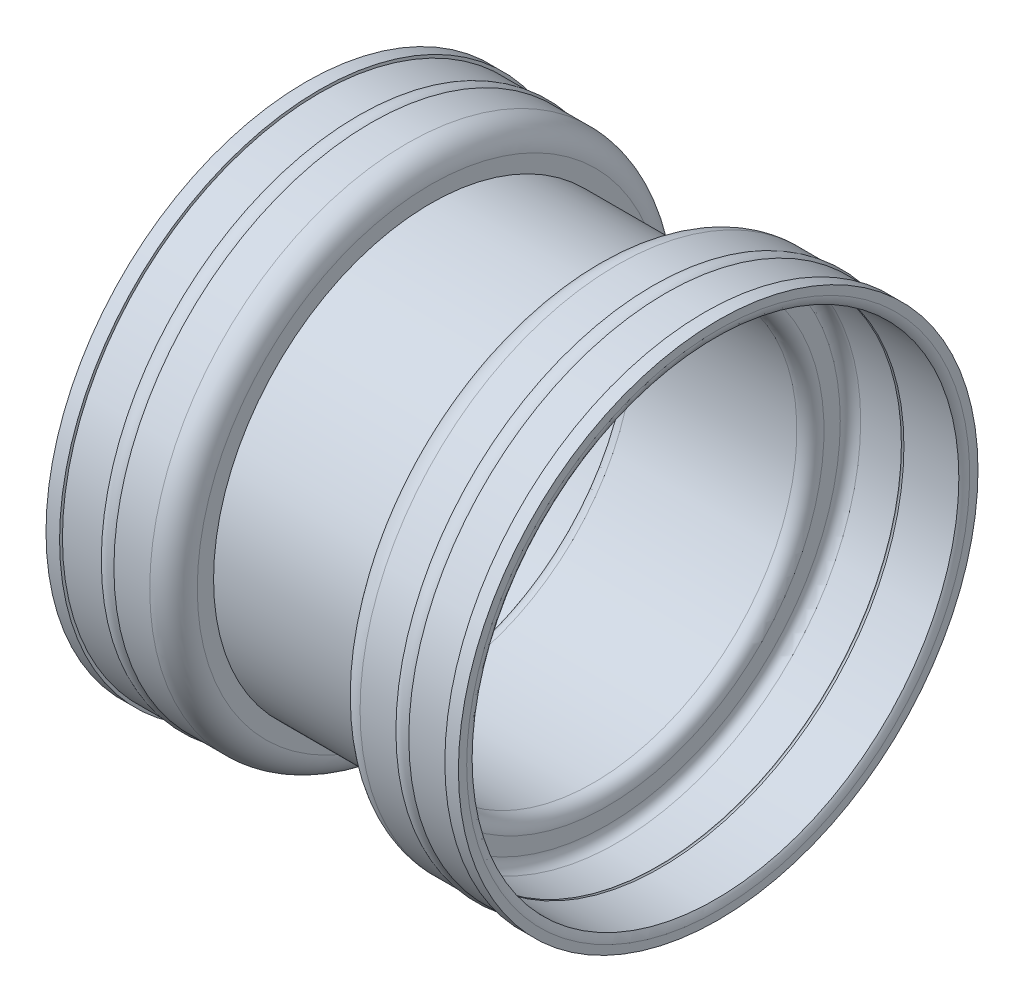
ISO-10303-21;
HEADER;
FILE_DESCRIPTION(('STEP AP214'),'2;1');
FILE_NAME('part.step','',(''),(''),'','','');
FILE_SCHEMA(('AUTOMOTIVE_DESIGN { 1 0 10303 214 1 1 1 1 }'));
ENDSEC;
DATA;
#1=APPLICATION_CONTEXT('core data for automotive mechanical design processes');
#2=APPLICATION_PROTOCOL_DEFINITION('international standard','automotive_design',2000,#1);
#3=PRODUCT_CONTEXT('',#1,'mechanical');
#4=PRODUCT('Part','Part','',(#3));
#5=PRODUCT_RELATED_PRODUCT_CATEGORY('part','',(#4));
#6=PRODUCT_DEFINITION_FORMATION('','',#4);
#7=PRODUCT_DEFINITION_CONTEXT('part definition',#1,'design');
#8=PRODUCT_DEFINITION('design','',#6,#7);
#9=PRODUCT_DEFINITION_SHAPE('','',#8);
#10=(LENGTH_UNIT() NAMED_UNIT(*) SI_UNIT(.MILLI.,.METRE.));
#11=(NAMED_UNIT(*) PLANE_ANGLE_UNIT() SI_UNIT($,.RADIAN.));
#12=(NAMED_UNIT(*) SI_UNIT($,.STERADIAN.) SOLID_ANGLE_UNIT());
#13=UNCERTAINTY_MEASURE_WITH_UNIT(LENGTH_MEASURE(1.E-05),#10,'distance_accuracy_value','');
#14=(GEOMETRIC_REPRESENTATION_CONTEXT(3) GLOBAL_UNCERTAINTY_ASSIGNED_CONTEXT((#13)) GLOBAL_UNIT_ASSIGNED_CONTEXT((#10,
#11,#12)) REPRESENTATION_CONTEXT('',''));
#15=CARTESIAN_POINT('',(0.,0.,0.));
#16=DIRECTION('',(0.,0.,1.));
#17=DIRECTION('',(1.,0.,0.));
#18=AXIS2_PLACEMENT_3D('',#15,#16,#17);
#19=CARTESIAN_POINT('',(-142.,185.405509101591,0.));
#20=DIRECTION('',(-1.,0.,0.));
#21=DIRECTION('',(0.,0.,1.));
#22=AXIS2_PLACEMENT_3D('',#19,#20,#21);
#23=PLANE('',#22);
#24=CARTESIAN_POINT('',(-142.,0.,0.));
#25=DIRECTION('',(-1.,0.,0.));
#26=DIRECTION('',(0.,0.,1.));
#27=AXIS2_PLACEMENT_3D('',#24,#25,#26);
#28=CIRCLE('',#27,191.520187809792);
#29=CARTESIAN_POINT('',(-142.,0.,191.520187809792));
#30=VERTEX_POINT('',#29);
#31=EDGE_CURVE('E91',#30,#30,#28,.T.);
#32=ORIENTED_EDGE('',*,*,#31,.F.);
#33=EDGE_LOOP('',(#32));
#34=FACE_BOUND('',#33,.T.);
#35=CARTESIAN_POINT('',(-142.,0.,0.));
#36=DIRECTION('',(-1.,0.,0.));
#37=DIRECTION('',(0.,0.,1.));
#38=AXIS2_PLACEMENT_3D('',#35,#36,#37);
#39=CIRCLE('',#38,189.405509101591);
#40=CARTESIAN_POINT('',(-142.,0.,189.405509101591));
#41=VERTEX_POINT('',#40);
#42=EDGE_CURVE('E10',#41,#41,#39,.T.);
#43=ORIENTED_EDGE('',*,*,#42,.T.);
#44=EDGE_LOOP('',(#43));
#45=FACE_BOUND('',#44,.T.);
#46=ADVANCED_FACE('F39',(#34,#45),#23,.F.);
#47=CARTESIAN_POINT('',(0.,0.,0.));
#48=DIRECTION('',(-1.,0.,0.));
#49=DIRECTION('',(0.,0.,1.));
#50=AXIS2_PLACEMENT_3D('',#47,#48,#49);
#51=CYLINDRICAL_SURFACE('',#50,189.405509101591);
#52=ORIENTED_EDGE('',*,*,#42,.F.);
#53=EDGE_LOOP('',(#52));
#54=FACE_BOUND('',#53,.T.);
#55=CARTESIAN_POINT('',(-113.345166872741,0.,0.));
#56=DIRECTION('',(-1.,0.,0.));
#57=DIRECTION('',(0.,0.,1.));
#58=AXIS2_PLACEMENT_3D('',#55,#56,#57);
#59=CIRCLE('',#58,189.405509101591);
#60=CARTESIAN_POINT('',(-113.345166872741,0.,189.405509101591));
#61=VERTEX_POINT('',#60);
#62=EDGE_CURVE('E45',#61,#61,#59,.T.);
#63=ORIENTED_EDGE('',*,*,#62,.T.);
#64=EDGE_LOOP('',(#63));
#65=FACE_BOUND('',#64,.T.);
#66=ADVANCED_FACE('F218',(#54,#65),#51,.T.);
#67=CARTESIAN_POINT('',(-108.520187809792,0.,0.));
#68=DIRECTION('',(-1.,0.,0.));
#69=DIRECTION('',(0.,0.,1.));
#70=AXIS2_PLACEMENT_3D('',#67,#68,#69);
#71=TOROIDAL_SURFACE('',#70,179.520187809792,11.);
#72=ORIENTED_EDGE('',*,*,#62,.F.);
#73=EDGE_LOOP('',(#72));
#74=FACE_BOUND('',#73,.T.);
#75=CARTESIAN_POINT('',(-103.937612114836,0.,0.));
#76=DIRECTION('',(-1.,0.,0.));
#77=DIRECTION('',(0.,0.,1.));
#78=AXIS2_PLACEMENT_3D('',#75,#76,#77);
#79=CIRCLE('',#78,189.520187809792);
#80=CARTESIAN_POINT('',(-103.937612114836,0.,189.520187809792));
#81=VERTEX_POINT('',#80);
#82=EDGE_CURVE('E49',#81,#81,#79,.T.);
#83=ORIENTED_EDGE('',*,*,#82,.T.);
#84=EDGE_LOOP('',(#83));
#85=FACE_BOUND('',#84,.T.);
#86=ADVANCED_FACE('F223',(#74,#85),#71,.T.);
#87=CARTESIAN_POINT('',(0.,0.,0.));
#88=DIRECTION('',(-1.,0.,0.));
#89=DIRECTION('',(0.,0.,1.));
#90=AXIS2_PLACEMENT_3D('',#87,#88,#89);
#91=CYLINDRICAL_SURFACE('',#90,189.520187809792);
#92=ORIENTED_EDGE('',*,*,#82,.F.);
#93=EDGE_LOOP('',(#92));
#94=FACE_BOUND('',#93,.T.);
#95=CARTESIAN_POINT('',(-77.5201878097921,0.,0.));
#96=DIRECTION('',(-1.,0.,0.));
#97=DIRECTION('',(0.,0.,1.));
#98=AXIS2_PLACEMENT_3D('',#95,#96,#97);
#99=CIRCLE('',#98,189.520187809792);
#100=CARTESIAN_POINT('',(-77.5201878097921,0.,189.520187809792));
#101=VERTEX_POINT('',#100);
#102=EDGE_CURVE('E53',#101,#101,#99,.T.);
#103=ORIENTED_EDGE('',*,*,#102,.T.);
#104=EDGE_LOOP('',(#103));
#105=FACE_BOUND('',#104,.T.);
#106=ADVANCED_FACE('F518',(#94,#105),#91,.T.);
#107=CARTESIAN_POINT('',(-77.5201878097921,0.,0.));
#108=DIRECTION('',(-1.,0.,0.));
#109=DIRECTION('',(0.,0.,1.));
#110=AXIS2_PLACEMENT_3D('',#107,#108,#109);
#111=TOROIDAL_SURFACE('',#110,172.,17.5201878097921);
#112=ORIENTED_EDGE('',*,*,#102,.F.);
#113=EDGE_LOOP('',(#112));
#114=FACE_BOUND('',#113,.T.);
#115=CARTESIAN_POINT('',(-60.,0.,0.));
#116=DIRECTION('',(-1.,0.,0.));
#117=DIRECTION('',(0.,0.,1.));
#118=AXIS2_PLACEMENT_3D('',#115,#116,#117);
#119=CIRCLE('',#118,172.);
#120=CARTESIAN_POINT('',(-60.,0.,172.));
#121=VERTEX_POINT('',#120);
#122=EDGE_CURVE('E58',#121,#121,#119,.T.);
#123=ORIENTED_EDGE('',*,*,#122,.T.);
#124=EDGE_LOOP('',(#123));
#125=FACE_BOUND('',#124,.T.);
#126=ADVANCED_FACE('F507',(#114,#125),#111,.T.);
#127=CARTESIAN_POINT('',(-60.,160.,0.));
#128=DIRECTION('',(-1.,0.,0.));
#129=DIRECTION('',(0.,0.,1.));
#130=AXIS2_PLACEMENT_3D('',#127,#128,#129);
#131=PLANE('',#130);
#132=ORIENTED_EDGE('',*,*,#122,.F.);
#133=EDGE_LOOP('',(#132));
#134=FACE_BOUND('',#133,.T.);
#135=CARTESIAN_POINT('',(-60.,0.,0.));
#136=DIRECTION('',(-1.,0.,0.));
#137=DIRECTION('',(0.,0.,1.));
#138=AXIS2_PLACEMENT_3D('',#135,#136,#137);
#139=CIRCLE('',#138,160.);
#140=CARTESIAN_POINT('',(-60.,0.,160.));
#141=VERTEX_POINT('',#140);
#142=EDGE_CURVE('E61',#141,#141,#139,.T.);
#143=ORIENTED_EDGE('',*,*,#142,.T.);
#144=EDGE_LOOP('',(#143));
#145=FACE_BOUND('',#144,.T.);
#146=ADVANCED_FACE('F214',(#134,#145),#131,.F.);
#147=CARTESIAN_POINT('',(0.,0.,0.));
#148=DIRECTION('',(-1.,0.,0.));
#149=DIRECTION('',(0.,0.,1.));
#150=AXIS2_PLACEMENT_3D('',#147,#148,#149);
#151=CYLINDRICAL_SURFACE('',#150,160.);
#152=ORIENTED_EDGE('',*,*,#142,.F.);
#153=EDGE_LOOP('',(#152));
#154=FACE_BOUND('',#153,.T.);
#155=CARTESIAN_POINT('',(60.,0.,0.));
#156=DIRECTION('',(-1.,0.,0.));
#157=DIRECTION('',(0.,0.,1.));
#158=AXIS2_PLACEMENT_3D('',#155,#156,#157);
#159=CIRCLE('',#158,160.);
#160=CARTESIAN_POINT('',(60.,0.,160.));
#161=VERTEX_POINT('',#160);
#162=EDGE_CURVE('E109',#161,#161,#159,.T.);
#163=ORIENTED_EDGE('',*,*,#162,.T.);
#164=EDGE_LOOP('',(#163));
#165=FACE_BOUND('',#164,.T.);
#166=ADVANCED_FACE('F204',(#154,#165),#151,.T.);
#167=CARTESIAN_POINT('',(0.,0.,0.));
#168=DIRECTION('',(-1.,0.,0.));
#169=DIRECTION('',(0.,0.,1.));
#170=AXIS2_PLACEMENT_3D('',#167,#168,#169);
#171=CYLINDRICAL_SURFACE('',#170,150.);
#172=CARTESIAN_POINT('',(-60.,0.,0.));
#173=DIRECTION('',(-1.,0.,0.));
#174=DIRECTION('',(0.,0.,1.));
#175=AXIS2_PLACEMENT_3D('',#172,#173,#174);
#176=CIRCLE('',#175,150.);
#177=CARTESIAN_POINT('',(-60.,0.,150.));
#178=VERTEX_POINT('',#177);
#179=EDGE_CURVE('E64',#178,#178,#176,.T.);
#180=ORIENTED_EDGE('',*,*,#179,.T.);
#181=EDGE_LOOP('',(#180));
#182=FACE_BOUND('',#181,.T.);
#183=CARTESIAN_POINT('',(60.,0.,0.));
#184=DIRECTION('',(-1.,0.,0.));
#185=DIRECTION('',(0.,0.,1.));
#186=AXIS2_PLACEMENT_3D('',#183,#184,#185);
#187=CIRCLE('',#186,150.);
#188=CARTESIAN_POINT('',(60.,0.,150.));
#189=VERTEX_POINT('',#188);
#190=EDGE_CURVE('E112',#189,#189,#187,.T.);
#191=ORIENTED_EDGE('',*,*,#190,.F.);
#192=EDGE_LOOP('',(#191));
#193=FACE_BOUND('',#192,.T.);
#194=ADVANCED_FACE('F201',(#182,#193),#171,.F.);
#195=CARTESIAN_POINT('',(-60.,0.,0.));
#196=DIRECTION('',(-1.,0.,0.));
#197=DIRECTION('',(0.,0.,1.));
#198=AXIS2_PLACEMENT_3D('',#195,#196,#197);
#199=TOROIDAL_SURFACE('',#198,160.,10.);
#200=CARTESIAN_POINT('',(-70.,0.,0.));
#201=DIRECTION('',(-1.,0.,0.));
#202=DIRECTION('',(0.,0.,1.));
#203=AXIS2_PLACEMENT_3D('',#200,#201,#202);
#204=CIRCLE('',#203,160.);
#205=CARTESIAN_POINT('',(-70.,0.,160.));
#206=VERTEX_POINT('',#205);
#207=EDGE_CURVE('E67',#206,#206,#204,.T.);
#208=ORIENTED_EDGE('',*,*,#207,.T.);
#209=EDGE_LOOP('',(#208));
#210=FACE_BOUND('',#209,.T.);
#211=ORIENTED_EDGE('',*,*,#179,.F.);
#212=EDGE_LOOP('',(#211));
#213=FACE_BOUND('',#212,.T.);
#214=ADVANCED_FACE('F203',(#210,#213),#199,.T.);
#215=CARTESIAN_POINT('',(-70.,160.,0.));
#216=DIRECTION('',(-1.,0.,0.));
#217=DIRECTION('',(0.,0.,1.));
#218=AXIS2_PLACEMENT_3D('',#215,#216,#217);
#219=PLANE('',#218);
#220=CARTESIAN_POINT('',(-70.,0.,0.));
#221=DIRECTION('',(-1.,0.,0.));
#222=DIRECTION('',(0.,0.,1.));
#223=AXIS2_PLACEMENT_3D('',#220,#221,#222);
#224=CIRCLE('',#223,172.);
#225=CARTESIAN_POINT('',(-70.,0.,172.));
#226=VERTEX_POINT('',#225);
#227=EDGE_CURVE('E70',#226,#226,#224,.T.);
#228=ORIENTED_EDGE('',*,*,#227,.T.);
#229=EDGE_LOOP('',(#228));
#230=FACE_BOUND('',#229,.T.);
#231=ORIENTED_EDGE('',*,*,#207,.F.);
#232=EDGE_LOOP('',(#231));
#233=FACE_BOUND('',#232,.T.);
#234=ADVANCED_FACE('F211',(#230,#233),#219,.T.);
#235=CARTESIAN_POINT('',(-77.5201878097921,0.,0.));
#236=DIRECTION('',(-1.,0.,0.));
#237=DIRECTION('',(0.,0.,1.));
#238=AXIS2_PLACEMENT_3D('',#235,#236,#237);
#239=TOROIDAL_SURFACE('',#238,172.,7.52018780979206);
#240=CARTESIAN_POINT('',(-77.5201878097921,0.,0.));
#241=DIRECTION('',(-1.,0.,0.));
#242=DIRECTION('',(0.,0.,1.));
#243=AXIS2_PLACEMENT_3D('',#240,#241,#242);
#244=CIRCLE('',#243,179.520187809792);
#245=CARTESIAN_POINT('',(-77.5201878097921,0.,179.520187809792));
#246=VERTEX_POINT('',#245);
#247=EDGE_CURVE('E73',#246,#246,#244,.T.);
#248=ORIENTED_EDGE('',*,*,#247,.T.);
#249=EDGE_LOOP('',(#248));
#250=FACE_BOUND('',#249,.T.);
#251=ORIENTED_EDGE('',*,*,#227,.F.);
#252=EDGE_LOOP('',(#251));
#253=FACE_BOUND('',#252,.T.);
#254=ADVANCED_FACE('F260',(#250,#253),#239,.F.);
#255=CARTESIAN_POINT('',(0.,0.,0.));
#256=DIRECTION('',(-1.,0.,0.));
#257=DIRECTION('',(0.,0.,1.));
#258=AXIS2_PLACEMENT_3D('',#255,#256,#257);
#259=CYLINDRICAL_SURFACE('',#258,179.520187809792);
#260=CARTESIAN_POINT('',(-107.520187809792,0.,0.));
#261=DIRECTION('',(-1.,0.,0.));
#262=DIRECTION('',(0.,0.,1.));
#263=AXIS2_PLACEMENT_3D('',#260,#261,#262);
#264=CIRCLE('',#263,179.520187809792);
#265=CARTESIAN_POINT('',(-107.520187809792,0.,179.520187809792));
#266=VERTEX_POINT('',#265);
#267=EDGE_CURVE('E76',#266,#266,#264,.T.);
#268=ORIENTED_EDGE('',*,*,#267,.T.);
#269=EDGE_LOOP('',(#268));
#270=FACE_BOUND('',#269,.T.);
#271=ORIENTED_EDGE('',*,*,#247,.F.);
#272=EDGE_LOOP('',(#271));
#273=FACE_BOUND('',#272,.T.);
#274=ADVANCED_FACE('F254',(#270,#273),#259,.F.);
#275=CARTESIAN_POINT('',(-108.520187809792,0.,0.));
#276=DIRECTION('',(-1.,0.,0.));
#277=DIRECTION('',(0.,0.,1.));
#278=AXIS2_PLACEMENT_3D('',#275,#276,#277);
#279=TOROIDAL_SURFACE('',#278,179.520187809792,1.);
#280=CARTESIAN_POINT('',(-109.513590444118,0.,0.));
#281=DIRECTION('',(-1.,0.,0.));
#282=DIRECTION('',(0.,0.,1.));
#283=AXIS2_PLACEMENT_3D('',#280,#281,#282);
#284=CIRCLE('',#283,179.405509101591);
#285=CARTESIAN_POINT('',(-109.513590444118,0.,179.405509101591));
#286=VERTEX_POINT('',#285);
#287=EDGE_CURVE('E79',#286,#286,#284,.T.);
#288=ORIENTED_EDGE('',*,*,#287,.T.);
#289=EDGE_LOOP('',(#288));
#290=FACE_BOUND('',#289,.T.);
#291=ORIENTED_EDGE('',*,*,#267,.F.);
#292=EDGE_LOOP('',(#291));
#293=FACE_BOUND('',#292,.T.);
#294=ADVANCED_FACE('F248',(#290,#293),#279,.F.);
#295=CARTESIAN_POINT('',(0.,0.,0.));
#296=DIRECTION('',(-1.,0.,0.));
#297=DIRECTION('',(0.,0.,1.));
#298=AXIS2_PLACEMENT_3D('',#295,#296,#297);
#299=CYLINDRICAL_SURFACE('',#298,179.405509101591);
#300=CARTESIAN_POINT('',(-150.,0.,0.));
#301=DIRECTION('',(-1.,0.,0.));
#302=DIRECTION('',(0.,0.,1.));
#303=AXIS2_PLACEMENT_3D('',#300,#301,#302);
#304=CIRCLE('',#303,179.405509101591);
#305=CARTESIAN_POINT('',(-150.,0.,179.405509101591));
#306=VERTEX_POINT('',#305);
#307=EDGE_CURVE('E82',#306,#306,#304,.T.);
#308=ORIENTED_EDGE('',*,*,#307,.T.);
#309=EDGE_LOOP('',(#308));
#310=FACE_BOUND('',#309,.T.);
#311=ORIENTED_EDGE('',*,*,#287,.F.);
#312=EDGE_LOOP('',(#311));
#313=FACE_BOUND('',#312,.T.);
#314=ADVANCED_FACE('F242',(#310,#313),#299,.F.);
#315=CARTESIAN_POINT('',(-142.,0.,0.));
#316=DIRECTION('',(-1.,0.,0.));
#317=DIRECTION('',(0.,0.,1.));
#318=AXIS2_PLACEMENT_3D('',#315,#316,#317);
#319=TOROIDAL_SURFACE('',#318,185.405509101591,9.99999999999999);
#320=CARTESIAN_POINT('',(-152.,0.,0.));
#321=DIRECTION('',(-1.,0.,0.));
#322=DIRECTION('',(0.,0.,1.));
#323=AXIS2_PLACEMENT_3D('',#320,#321,#322);
#324=CIRCLE('',#323,185.405509101591);
#325=CARTESIAN_POINT('',(-152.,0.,185.405509101591));
#326=VERTEX_POINT('',#325);
#327=EDGE_CURVE('E85',#326,#326,#324,.T.);
#328=ORIENTED_EDGE('',*,*,#327,.T.);
#329=EDGE_LOOP('',(#328));
#330=FACE_BOUND('',#329,.T.);
#331=ORIENTED_EDGE('',*,*,#307,.F.);
#332=EDGE_LOOP('',(#331));
#333=FACE_BOUND('',#332,.T.);
#334=ADVANCED_FACE('F236',(#330,#333),#319,.T.);
#335=CARTESIAN_POINT('',(-152.,185.405509101591,0.));
#336=DIRECTION('',(-1.,0.,0.));
#337=DIRECTION('',(0.,0.,1.));
#338=AXIS2_PLACEMENT_3D('',#335,#336,#337);
#339=PLANE('',#338);
#340=CARTESIAN_POINT('',(-152.,0.,0.));
#341=DIRECTION('',(-1.,0.,0.));
#342=DIRECTION('',(0.,0.,1.));
#343=AXIS2_PLACEMENT_3D('',#340,#341,#342);
#344=CIRCLE('',#343,191.520187809792);
#345=CARTESIAN_POINT('',(-152.,0.,191.520187809792));
#346=VERTEX_POINT('',#345);
#347=EDGE_CURVE('E88',#346,#346,#344,.T.);
#348=ORIENTED_EDGE('',*,*,#347,.T.);
#349=EDGE_LOOP('',(#348));
#350=FACE_BOUND('',#349,.T.);
#351=ORIENTED_EDGE('',*,*,#327,.F.);
#352=EDGE_LOOP('',(#351));
#353=FACE_BOUND('',#352,.T.);
#354=ADVANCED_FACE('F230',(#350,#353),#339,.T.);
#355=CARTESIAN_POINT('',(0.,0.,0.));
#356=DIRECTION('',(-1.,0.,0.));
#357=DIRECTION('',(0.,0.,1.));
#358=AXIS2_PLACEMENT_3D('',#355,#356,#357);
#359=CYLINDRICAL_SURFACE('',#358,191.520187809792);
#360=ORIENTED_EDGE('',*,*,#31,.T.);
#361=EDGE_LOOP('',(#360));
#362=FACE_BOUND('',#361,.T.);
#363=ORIENTED_EDGE('',*,*,#347,.F.);
#364=EDGE_LOOP('',(#363));
#365=FACE_BOUND('',#364,.T.);
#366=ADVANCED_FACE('F227',(#362,#365),#359,.T.);
#367=CARTESIAN_POINT('',(142.,185.405509101591,0.));
#368=DIRECTION('',(1.,0.,0.));
#369=DIRECTION('',(0.,0.,1.));
#370=AXIS2_PLACEMENT_3D('',#367,#368,#369);
#371=PLANE('',#370);
#372=CARTESIAN_POINT('',(142.,0.,0.));
#373=DIRECTION('',(-1.,0.,0.));
#374=DIRECTION('',(0.,0.,1.));
#375=AXIS2_PLACEMENT_3D('',#372,#373,#374);
#376=CIRCLE('',#375,191.520187809792);
#377=CARTESIAN_POINT('',(142.,0.,191.520187809792));
#378=VERTEX_POINT('',#377);
#379=EDGE_CURVE('E139',#378,#378,#376,.T.);
#380=ORIENTED_EDGE('',*,*,#379,.T.);
#381=EDGE_LOOP('',(#380));
#382=FACE_BOUND('',#381,.T.);
#383=CARTESIAN_POINT('',(142.,0.,0.));
#384=DIRECTION('',(-1.,0.,0.));
#385=DIRECTION('',(0.,0.,1.));
#386=AXIS2_PLACEMENT_3D('',#383,#384,#385);
#387=CIRCLE('',#386,189.405509101591);
#388=CARTESIAN_POINT('',(142.,0.,189.405509101591));
#389=VERTEX_POINT('',#388);
#390=EDGE_CURVE('E94',#389,#389,#387,.T.);
#391=ORIENTED_EDGE('',*,*,#390,.F.);
#392=EDGE_LOOP('',(#391));
#393=FACE_BOUND('',#392,.T.);
#394=ADVANCED_FACE('F143',(#382,#393),#371,.F.);
#395=CARTESIAN_POINT('',(0.,0.,0.));
#396=DIRECTION('',(1.,0.,0.));
#397=DIRECTION('',(0.,0.,1.));
#398=AXIS2_PLACEMENT_3D('',#395,#396,#397);
#399=CYLINDRICAL_SURFACE('',#398,189.405509101591);
#400=ORIENTED_EDGE('',*,*,#390,.T.);
#401=EDGE_LOOP('',(#400));
#402=FACE_BOUND('',#401,.T.);
#403=CARTESIAN_POINT('',(113.345166872741,0.,0.));
#404=DIRECTION('',(-1.,0.,0.));
#405=DIRECTION('',(0.,0.,1.));
#406=AXIS2_PLACEMENT_3D('',#403,#404,#405);
#407=CIRCLE('',#406,189.405509101591);
#408=CARTESIAN_POINT('',(113.345166872741,0.,189.405509101591));
#409=VERTEX_POINT('',#408);
#410=EDGE_CURVE('E97',#409,#409,#407,.T.);
#411=ORIENTED_EDGE('',*,*,#410,.F.);
#412=EDGE_LOOP('',(#411));
#413=FACE_BOUND('',#412,.T.);
#414=ADVANCED_FACE('F280',(#402,#413),#399,.T.);
#415=CARTESIAN_POINT('',(108.520187809792,0.,0.));
#416=DIRECTION('',(1.,0.,0.));
#417=DIRECTION('',(0.,0.,1.));
#418=AXIS2_PLACEMENT_3D('',#415,#416,#417);
#419=TOROIDAL_SURFACE('',#418,179.520187809792,11.);
#420=ORIENTED_EDGE('',*,*,#410,.T.);
#421=EDGE_LOOP('',(#420));
#422=FACE_BOUND('',#421,.T.);
#423=CARTESIAN_POINT('',(103.937612114836,0.,0.));
#424=DIRECTION('',(-1.,0.,0.));
#425=DIRECTION('',(0.,0.,1.));
#426=AXIS2_PLACEMENT_3D('',#423,#424,#425);
#427=CIRCLE('',#426,189.520187809792);
#428=CARTESIAN_POINT('',(103.937612114836,0.,189.520187809792));
#429=VERTEX_POINT('',#428);
#430=EDGE_CURVE('E100',#429,#429,#427,.T.);
#431=ORIENTED_EDGE('',*,*,#430,.F.);
#432=EDGE_LOOP('',(#431));
#433=FACE_BOUND('',#432,.T.);
#434=ADVANCED_FACE('F283',(#422,#433),#419,.T.);
#435=CARTESIAN_POINT('',(0.,0.,0.));
#436=DIRECTION('',(1.,0.,0.));
#437=DIRECTION('',(0.,0.,1.));
#438=AXIS2_PLACEMENT_3D('',#435,#436,#437);
#439=CYLINDRICAL_SURFACE('',#438,189.520187809792);
#440=ORIENTED_EDGE('',*,*,#430,.T.);
#441=EDGE_LOOP('',(#440));
#442=FACE_BOUND('',#441,.T.);
#443=CARTESIAN_POINT('',(77.5201878097921,0.,0.));
#444=DIRECTION('',(-1.,0.,0.));
#445=DIRECTION('',(0.,0.,1.));
#446=AXIS2_PLACEMENT_3D('',#443,#444,#445);
#447=CIRCLE('',#446,189.520187809792);
#448=CARTESIAN_POINT('',(77.5201878097921,0.,189.520187809792));
#449=VERTEX_POINT('',#448);
#450=EDGE_CURVE('E103',#449,#449,#447,.T.);
#451=ORIENTED_EDGE('',*,*,#450,.F.);
#452=EDGE_LOOP('',(#451));
#453=FACE_BOUND('',#452,.T.);
#454=ADVANCED_FACE('F287',(#442,#453),#439,.T.);
#455=CARTESIAN_POINT('',(77.5201878097921,0.,0.));
#456=DIRECTION('',(1.,0.,0.));
#457=DIRECTION('',(0.,0.,1.));
#458=AXIS2_PLACEMENT_3D('',#455,#456,#457);
#459=TOROIDAL_SURFACE('',#458,172.,17.5201878097921);
#460=ORIENTED_EDGE('',*,*,#450,.T.);
#461=EDGE_LOOP('',(#460));
#462=FACE_BOUND('',#461,.T.);
#463=CARTESIAN_POINT('',(60.,0.,0.));
#464=DIRECTION('',(-1.,0.,0.));
#465=DIRECTION('',(0.,0.,1.));
#466=AXIS2_PLACEMENT_3D('',#463,#464,#465);
#467=CIRCLE('',#466,172.);
#468=CARTESIAN_POINT('',(60.,0.,172.));
#469=VERTEX_POINT('',#468);
#470=EDGE_CURVE('E106',#469,#469,#467,.T.);
#471=ORIENTED_EDGE('',*,*,#470,.F.);
#472=EDGE_LOOP('',(#471));
#473=FACE_BOUND('',#472,.T.);
#474=ADVANCED_FACE('F291',(#462,#473),#459,.T.);
#475=CARTESIAN_POINT('',(60.,160.,0.));
#476=DIRECTION('',(1.,0.,0.));
#477=DIRECTION('',(0.,0.,1.));
#478=AXIS2_PLACEMENT_3D('',#475,#476,#477);
#479=PLANE('',#478);
#480=ORIENTED_EDGE('',*,*,#470,.T.);
#481=EDGE_LOOP('',(#480));
#482=FACE_BOUND('',#481,.T.);
#483=ORIENTED_EDGE('',*,*,#162,.F.);
#484=EDGE_LOOP('',(#483));
#485=FACE_BOUND('',#484,.T.);
#486=ADVANCED_FACE('F197',(#482,#485),#479,.F.);
#487=CARTESIAN_POINT('',(60.,0.,0.));
#488=DIRECTION('',(1.,0.,0.));
#489=DIRECTION('',(0.,0.,1.));
#490=AXIS2_PLACEMENT_3D('',#487,#488,#489);
#491=TOROIDAL_SURFACE('',#490,160.,10.);
#492=CARTESIAN_POINT('',(70.,0.,0.));
#493=DIRECTION('',(-1.,0.,0.));
#494=DIRECTION('',(0.,0.,1.));
#495=AXIS2_PLACEMENT_3D('',#492,#493,#494);
#496=CIRCLE('',#495,160.);
#497=CARTESIAN_POINT('',(70.,0.,160.));
#498=VERTEX_POINT('',#497);
#499=EDGE_CURVE('E115',#498,#498,#496,.T.);
#500=ORIENTED_EDGE('',*,*,#499,.F.);
#501=EDGE_LOOP('',(#500));
#502=FACE_BOUND('',#501,.T.);
#503=ORIENTED_EDGE('',*,*,#190,.T.);
#504=EDGE_LOOP('',(#503));
#505=FACE_BOUND('',#504,.T.);
#506=ADVANCED_FACE('F191',(#502,#505),#491,.T.);
#507=CARTESIAN_POINT('',(70.,160.,0.));
#508=DIRECTION('',(1.,0.,0.));
#509=DIRECTION('',(0.,0.,1.));
#510=AXIS2_PLACEMENT_3D('',#507,#508,#509);
#511=PLANE('',#510);
#512=CARTESIAN_POINT('',(70.,0.,0.));
#513=DIRECTION('',(-1.,0.,0.));
#514=DIRECTION('',(0.,0.,1.));
#515=AXIS2_PLACEMENT_3D('',#512,#513,#514);
#516=CIRCLE('',#515,172.);
#517=CARTESIAN_POINT('',(70.,0.,172.));
#518=VERTEX_POINT('',#517);
#519=EDGE_CURVE('E118',#518,#518,#516,.T.);
#520=ORIENTED_EDGE('',*,*,#519,.F.);
#521=EDGE_LOOP('',(#520));
#522=FACE_BOUND('',#521,.T.);
#523=ORIENTED_EDGE('',*,*,#499,.T.);
#524=EDGE_LOOP('',(#523));
#525=FACE_BOUND('',#524,.T.);
#526=ADVANCED_FACE('F185',(#522,#525),#511,.T.);
#527=CARTESIAN_POINT('',(77.5201878097921,0.,0.));
#528=DIRECTION('',(1.,0.,0.));
#529=DIRECTION('',(0.,0.,1.));
#530=AXIS2_PLACEMENT_3D('',#527,#528,#529);
#531=TOROIDAL_SURFACE('',#530,172.,7.52018780979206);
#532=CARTESIAN_POINT('',(77.5201878097921,0.,0.));
#533=DIRECTION('',(-1.,0.,0.));
#534=DIRECTION('',(0.,0.,1.));
#535=AXIS2_PLACEMENT_3D('',#532,#533,#534);
#536=CIRCLE('',#535,179.520187809792);
#537=CARTESIAN_POINT('',(77.5201878097921,0.,179.520187809792));
#538=VERTEX_POINT('',#537);
#539=EDGE_CURVE('E121',#538,#538,#536,.T.);
#540=ORIENTED_EDGE('',*,*,#539,.F.);
#541=EDGE_LOOP('',(#540));
#542=FACE_BOUND('',#541,.T.);
#543=ORIENTED_EDGE('',*,*,#519,.T.);
#544=EDGE_LOOP('',(#543));
#545=FACE_BOUND('',#544,.T.);
#546=ADVANCED_FACE('F179',(#542,#545),#531,.F.);
#547=CARTESIAN_POINT('',(0.,0.,0.));
#548=DIRECTION('',(1.,0.,0.));
#549=DIRECTION('',(0.,0.,1.));
#550=AXIS2_PLACEMENT_3D('',#547,#548,#549);
#551=CYLINDRICAL_SURFACE('',#550,179.520187809792);
#552=CARTESIAN_POINT('',(107.520187809792,0.,0.));
#553=DIRECTION('',(-1.,0.,0.));
#554=DIRECTION('',(0.,0.,1.));
#555=AXIS2_PLACEMENT_3D('',#552,#553,#554);
#556=CIRCLE('',#555,179.520187809792);
#557=CARTESIAN_POINT('',(107.520187809792,0.,179.520187809792));
#558=VERTEX_POINT('',#557);
#559=EDGE_CURVE('E124',#558,#558,#556,.T.);
#560=ORIENTED_EDGE('',*,*,#559,.F.);
#561=EDGE_LOOP('',(#560));
#562=FACE_BOUND('',#561,.T.);
#563=ORIENTED_EDGE('',*,*,#539,.T.);
#564=EDGE_LOOP('',(#563));
#565=FACE_BOUND('',#564,.T.);
#566=ADVANCED_FACE('F173',(#562,#565),#551,.F.);
#567=CARTESIAN_POINT('',(108.520187809792,0.,0.));
#568=DIRECTION('',(1.,0.,0.));
#569=DIRECTION('',(0.,0.,1.));
#570=AXIS2_PLACEMENT_3D('',#567,#568,#569);
#571=TOROIDAL_SURFACE('',#570,179.520187809792,1.);
#572=CARTESIAN_POINT('',(109.513590444118,0.,0.));
#573=DIRECTION('',(-1.,0.,0.));
#574=DIRECTION('',(0.,0.,1.));
#575=AXIS2_PLACEMENT_3D('',#572,#573,#574);
#576=CIRCLE('',#575,179.405509101591);
#577=CARTESIAN_POINT('',(109.513590444118,0.,179.405509101591));
#578=VERTEX_POINT('',#577);
#579=EDGE_CURVE('E127',#578,#578,#576,.T.);
#580=ORIENTED_EDGE('',*,*,#579,.F.);
#581=EDGE_LOOP('',(#580));
#582=FACE_BOUND('',#581,.T.);
#583=ORIENTED_EDGE('',*,*,#559,.T.);
#584=EDGE_LOOP('',(#583));
#585=FACE_BOUND('',#584,.T.);
#586=ADVANCED_FACE('F167',(#582,#585),#571,.F.);
#587=CARTESIAN_POINT('',(0.,0.,0.));
#588=DIRECTION('',(1.,0.,0.));
#589=DIRECTION('',(0.,0.,1.));
#590=AXIS2_PLACEMENT_3D('',#587,#588,#589);
#591=CYLINDRICAL_SURFACE('',#590,179.405509101591);
#592=CARTESIAN_POINT('',(150.,0.,0.));
#593=DIRECTION('',(-1.,0.,0.));
#594=DIRECTION('',(0.,0.,1.));
#595=AXIS2_PLACEMENT_3D('',#592,#593,#594);
#596=CIRCLE('',#595,179.405509101591);
#597=CARTESIAN_POINT('',(150.,0.,179.405509101591));
#598=VERTEX_POINT('',#597);
#599=EDGE_CURVE('E130',#598,#598,#596,.T.);
#600=ORIENTED_EDGE('',*,*,#599,.F.);
#601=EDGE_LOOP('',(#600));
#602=FACE_BOUND('',#601,.T.);
#603=ORIENTED_EDGE('',*,*,#579,.T.);
#604=EDGE_LOOP('',(#603));
#605=FACE_BOUND('',#604,.T.);
#606=ADVANCED_FACE('F161',(#602,#605),#591,.F.);
#607=CARTESIAN_POINT('',(142.,0.,0.));
#608=DIRECTION('',(1.,0.,0.));
#609=DIRECTION('',(0.,0.,1.));
#610=AXIS2_PLACEMENT_3D('',#607,#608,#609);
#611=TOROIDAL_SURFACE('',#610,185.405509101591,9.99999999999999);
#612=CARTESIAN_POINT('',(152.,0.,0.));
#613=DIRECTION('',(-1.,0.,0.));
#614=DIRECTION('',(0.,0.,1.));
#615=AXIS2_PLACEMENT_3D('',#612,#613,#614);
#616=CIRCLE('',#615,185.405509101591);
#617=CARTESIAN_POINT('',(152.,0.,185.405509101591));
#618=VERTEX_POINT('',#617);
#619=EDGE_CURVE('E133',#618,#618,#616,.T.);
#620=ORIENTED_EDGE('',*,*,#619,.F.);
#621=EDGE_LOOP('',(#620));
#622=FACE_BOUND('',#621,.T.);
#623=ORIENTED_EDGE('',*,*,#599,.T.);
#624=EDGE_LOOP('',(#623));
#625=FACE_BOUND('',#624,.T.);
#626=ADVANCED_FACE('F155',(#622,#625),#611,.T.);
#627=CARTESIAN_POINT('',(152.,185.405509101591,0.));
#628=DIRECTION('',(1.,0.,0.));
#629=DIRECTION('',(0.,0.,1.));
#630=AXIS2_PLACEMENT_3D('',#627,#628,#629);
#631=PLANE('',#630);
#632=CARTESIAN_POINT('',(152.,0.,0.));
#633=DIRECTION('',(-1.,0.,0.));
#634=DIRECTION('',(0.,0.,1.));
#635=AXIS2_PLACEMENT_3D('',#632,#633,#634);
#636=CIRCLE('',#635,191.520187809792);
#637=CARTESIAN_POINT('',(152.,0.,191.520187809792));
#638=VERTEX_POINT('',#637);
#639=EDGE_CURVE('E136',#638,#638,#636,.T.);
#640=ORIENTED_EDGE('',*,*,#639,.F.);
#641=EDGE_LOOP('',(#640));
#642=FACE_BOUND('',#641,.T.);
#643=ORIENTED_EDGE('',*,*,#619,.T.);
#644=EDGE_LOOP('',(#643));
#645=FACE_BOUND('',#644,.T.);
#646=ADVANCED_FACE('F149',(#642,#645),#631,.T.);
#647=CARTESIAN_POINT('',(0.,0.,0.));
#648=DIRECTION('',(1.,0.,0.));
#649=DIRECTION('',(0.,0.,1.));
#650=AXIS2_PLACEMENT_3D('',#647,#648,#649);
#651=CYLINDRICAL_SURFACE('',#650,191.520187809792);
#652=ORIENTED_EDGE('',*,*,#379,.F.);
#653=EDGE_LOOP('',(#652));
#654=FACE_BOUND('',#653,.T.);
#655=ORIENTED_EDGE('',*,*,#639,.T.);
#656=EDGE_LOOP('',(#655));
#657=FACE_BOUND('',#656,.T.);
#658=ADVANCED_FACE('F146',(#654,#657),#651,.T.);
#659=CLOSED_SHELL('',(#46,#66,#86,#106,#126,#146,#166,#194,#214,#234,#254,#274,#294,#314,#334,
#354,#366,#394,#414,#434,#454,#474,#486,#506,#526,#546,#566,#586,#606,#626,#646,#658));
#660=MANIFOLD_SOLID_BREP('B2',#659);
#661=ADVANCED_BREP_SHAPE_REPRESENTATION('',(#18,#660),#14);
#662=SHAPE_DEFINITION_REPRESENTATION(#9,#661);
ENDSEC;
END-ISO-10303-21;
